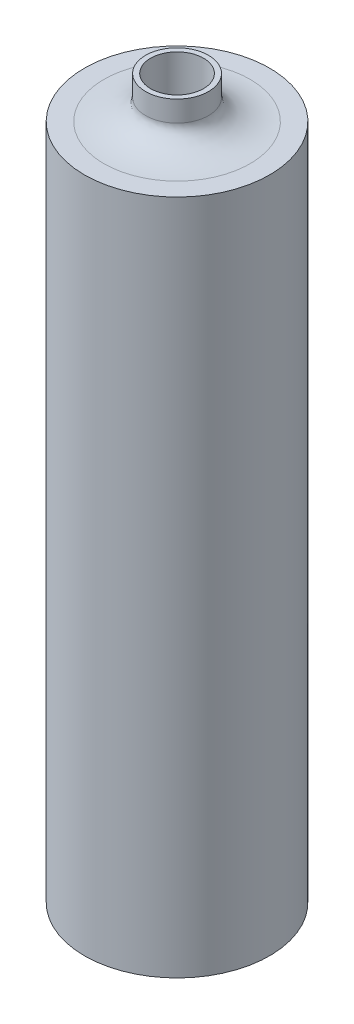
ISO-10303-21;
HEADER;
FILE_DESCRIPTION(('STEP AP214'),'2;1');
FILE_NAME('part.step','',(''),(''),'','','');
FILE_SCHEMA(('AUTOMOTIVE_DESIGN { 1 0 10303 214 1 1 1 1 }'));
ENDSEC;
DATA;
#1=APPLICATION_CONTEXT('core data for automotive mechanical design processes');
#2=APPLICATION_PROTOCOL_DEFINITION('international standard','automotive_design',2000,#1);
#3=PRODUCT_CONTEXT('',#1,'mechanical');
#4=PRODUCT('Part','Part','',(#3));
#5=PRODUCT_RELATED_PRODUCT_CATEGORY('part','',(#4));
#6=PRODUCT_DEFINITION_FORMATION('','',#4);
#7=PRODUCT_DEFINITION_CONTEXT('part definition',#1,'design');
#8=PRODUCT_DEFINITION('design','',#6,#7);
#9=PRODUCT_DEFINITION_SHAPE('','',#8);
#10=(LENGTH_UNIT() NAMED_UNIT(*) SI_UNIT(.MILLI.,.METRE.));
#11=(NAMED_UNIT(*) PLANE_ANGLE_UNIT() SI_UNIT($,.RADIAN.));
#12=(NAMED_UNIT(*) SI_UNIT($,.STERADIAN.) SOLID_ANGLE_UNIT());
#13=UNCERTAINTY_MEASURE_WITH_UNIT(LENGTH_MEASURE(1.E-05),#10,'distance_accuracy_value','');
#14=(GEOMETRIC_REPRESENTATION_CONTEXT(3) GLOBAL_UNCERTAINTY_ASSIGNED_CONTEXT((#13)) GLOBAL_UNIT_ASSIGNED_CONTEXT((#10,
#11,#12)) REPRESENTATION_CONTEXT('',''));
#15=CARTESIAN_POINT('',(0.,0.,0.));
#16=DIRECTION('',(0.,0.,1.));
#17=DIRECTION('',(1.,0.,0.));
#18=AXIS2_PLACEMENT_3D('',#15,#16,#17);
#19=CARTESIAN_POINT('',(0.,162.4,0.));
#20=DIRECTION('',(0.,1.,0.));
#21=DIRECTION('',(0.,0.,1.));
#22=AXIS2_PLACEMENT_3D('',#19,#20,#21);
#23=PLANE('',#22);
#24=CARTESIAN_POINT('',(0.,162.4,17.55));
#25=CARTESIAN_POINT('',(2.29728962670413,162.4,17.55));
#26=CARTESIAN_POINT('',(4.5936753716554,162.4,17.0932204750535));
#27=CARTESIAN_POINT('',(8.83851310435925,162.4,15.3349511160926));
#28=CARTESIAN_POINT('',(10.7852949364395,162.4,14.0341530832083));
#29=CARTESIAN_POINT('',(14.0341530832083,162.4,10.7852949364395));
#30=CARTESIAN_POINT('',(15.3349511160966,162.4,8.83851310436124));
#31=CARTESIAN_POINT('',(17.0932204750496,162.4,4.5936753716534));
#32=CARTESIAN_POINT('',(17.55,162.4,2.29728962669443));
#33=CARTESIAN_POINT('',(17.55,162.4,-2.29728962669442));
#34=CARTESIAN_POINT('',(17.0932204750535,162.4,-4.59367537165341));
#35=CARTESIAN_POINT('',(15.3349511160926,162.4,-8.83851310436125));
#36=CARTESIAN_POINT('',(14.0341530832067,162.4,-10.7852949364372));
#37=CARTESIAN_POINT('',(10.7852949364411,162.4,-14.0341530832107));
#38=CARTESIAN_POINT('',(8.83851310436157,162.4,-15.3349511160892));
#39=CARTESIAN_POINT('',(4.59367537165313,162.4,-17.093220475057));
#40=CARTESIAN_POINT('',(2.29728962669443,162.4,-17.55));
#41=CARTESIAN_POINT('',(-2.29728962669442,162.4,-17.55));
#42=CARTESIAN_POINT('',(-4.59367537165408,162.4,-17.093220475053));
#43=CARTESIAN_POINT('',(-8.83851310436053,162.4,-15.3349511160932));
#44=CARTESIAN_POINT('',(-10.7852949364372,162.4,-14.0341530832087));
#45=CARTESIAN_POINT('',(-14.0341530832107,162.4,-10.7852949364391));
#46=CARTESIAN_POINT('',(-15.3349511160921,162.4,-8.83851310436097));
#47=CARTESIAN_POINT('',(-17.0932204750541,162.4,-4.59367537165373));
#48=CARTESIAN_POINT('',(-17.55,162.4,-2.2972896266944));
#49=CARTESIAN_POINT('',(-17.55,162.4,2.29728962669445));
#50=CARTESIAN_POINT('',(-17.0932204750501,162.4,4.59367537165368));
#51=CARTESIAN_POINT('',(-15.3349511160961,162.4,8.83851310436092));
#52=CARTESIAN_POINT('',(-14.03415308321,162.4,10.7852949364398));
#53=CARTESIAN_POINT('',(-10.7852949364379,162.4,14.0341530832079));
#54=CARTESIAN_POINT('',(-8.83851310436097,162.4,15.3349511160921));
#55=CARTESIAN_POINT('',(-4.59367537165373,162.4,17.0932204750541));
#56=CARTESIAN_POINT('',(-2.29728962670413,162.4,17.55));
#57=CARTESIAN_POINT('',(0.,162.4,17.55));
#58=(BOUNDED_CURVE() B_SPLINE_CURVE(3,(#24,#25,#26,#27,#28,#29,#30,#31,#32,#33,#34,#35,#36,#37,
#38,#39,#40,#41,#42,#43,#44,#45,#46,#47,#48,#49,#50,#51,#52,#53,#54,#55,#56,#57),.UNSPECIFIED.,
.T.,.F.) B_SPLINE_CURVE_WITH_KNOTS((4,2,2,2,2,2,2,2,2,2,2,2,2,2,2,2,4),(0.,0.392699081698724,
0.785398163397448,1.17809724509617,1.5707963267949,1.96349540849362,2.35619449019234,
2.74889357189107,3.14159265358979,3.53429173528852,3.92699081698724,4.31968989868597,
4.71238898038469,5.10508806208341,5.49778714378214,5.89048622548086,6.28318530717959),
.UNSPECIFIED.) CURVE() GEOMETRIC_REPRESENTATION_ITEM() RATIONAL_B_SPLINE_CURVE((1.,1.,1.,1.,1.,
1.,1.,1.,1.,1.,1.,1.,1.,1.,1.,1.,1.,1.,1.,1.,1.,1.,1.,1.,1.,1.,1.,1.,1.,1.,1.,1.,1.,1.)) REPRESENTATION_ITEM(''));
#59=CARTESIAN_POINT('',(0.,162.4,17.55));
#60=VERTEX_POINT('',#59);
#61=EDGE_CURVE('E11',#60,#60,#58,.F.);
#62=ORIENTED_EDGE('',*,*,#61,.T.);
#63=EDGE_LOOP('',(#62));
#64=FACE_BOUND('',#63,.T.);
#65=CARTESIAN_POINT('',(0.,162.4,0.));
#66=DIRECTION('',(0.,1.,0.));
#67=DIRECTION('',(0.,0.,1.));
#68=AXIS2_PLACEMENT_3D('',#65,#66,#67);
#69=CIRCLE('',#68,22.225);
#70=CARTESIAN_POINT('',(0.,162.4,22.225));
#71=VERTEX_POINT('',#70);
#72=EDGE_CURVE('E212',#71,#71,#69,.T.);
#73=ORIENTED_EDGE('',*,*,#72,.T.);
#74=EDGE_LOOP('',(#73));
#75=FACE_BOUND('',#74,.T.);
#76=ADVANCED_FACE('F40',(#64,#75),#23,.T.);
#77=CARTESIAN_POINT('',(0.,0.,0.));
#78=DIRECTION('',(0.,1.,0.));
#79=DIRECTION('',(0.,0.,1.));
#80=AXIS2_PLACEMENT_3D('',#77,#78,#79);
#81=PLANE('',#80);
#82=CARTESIAN_POINT('',(0.,0.,0.));
#83=DIRECTION('',(0.,1.,0.));
#84=DIRECTION('',(0.,0.,1.));
#85=AXIS2_PLACEMENT_3D('',#82,#83,#84);
#86=CIRCLE('',#85,22.225);
#87=CARTESIAN_POINT('',(0.,0.,22.225));
#88=VERTEX_POINT('',#87);
#89=EDGE_CURVE('E58',#88,#88,#86,.T.);
#90=ORIENTED_EDGE('',*,*,#89,.F.);
#91=EDGE_LOOP('',(#90));
#92=FACE_BOUND('',#91,.T.);
#93=CARTESIAN_POINT('',(0.,0.,0.));
#94=DIRECTION('',(0.,1.,0.));
#95=DIRECTION('',(0.,0.,1.));
#96=AXIS2_PLACEMENT_3D('',#93,#94,#95);
#97=CIRCLE('',#96,19.05);
#98=CARTESIAN_POINT('',(0.,0.,19.05));
#99=VERTEX_POINT('',#98);
#100=EDGE_CURVE('E63',#99,#99,#97,.T.);
#101=ORIENTED_EDGE('',*,*,#100,.T.);
#102=EDGE_LOOP('',(#101));
#103=FACE_BOUND('',#102,.T.);
#104=ADVANCED_FACE('F95',(#92,#103),#81,.F.);
#105=CARTESIAN_POINT('',(0.,160.,0.));
#106=DIRECTION('',(0.,-1.,0.));
#107=DIRECTION('',(0.,0.,-1.));
#108=AXIS2_PLACEMENT_3D('',#105,#106,#107);
#109=CYLINDRICAL_SURFACE('',#108,22.225);
#110=ORIENTED_EDGE('',*,*,#89,.T.);
#111=EDGE_LOOP('',(#110));
#112=FACE_BOUND('',#111,.T.);
#113=ORIENTED_EDGE('',*,*,#72,.F.);
#114=EDGE_LOOP('',(#113));
#115=FACE_BOUND('',#114,.T.);
#116=ADVANCED_FACE('F144',(#112,#115),#109,.T.);
#117=CARTESIAN_POINT('',(0.,160.,0.));
#118=DIRECTION('',(0.,-1.,0.));
#119=DIRECTION('',(0.,0.,-1.));
#120=AXIS2_PLACEMENT_3D('',#117,#118,#119);
#121=CYLINDRICAL_SURFACE('',#120,19.05);
#122=CARTESIAN_POINT('',(0.,160.,0.));
#123=DIRECTION('',(0.,1.,0.));
#124=DIRECTION('',(0.,0.,1.));
#125=AXIS2_PLACEMENT_3D('',#122,#123,#124);
#126=CIRCLE('',#125,19.05);
#127=CARTESIAN_POINT('',(0.,160.,19.05));
#128=VERTEX_POINT('',#127);
#129=EDGE_CURVE('E68',#128,#128,#126,.T.);
#130=ORIENTED_EDGE('',*,*,#129,.T.);
#131=EDGE_LOOP('',(#130));
#132=FACE_BOUND('',#131,.T.);
#133=ORIENTED_EDGE('',*,*,#100,.F.);
#134=EDGE_LOOP('',(#133));
#135=FACE_BOUND('',#134,.T.);
#136=ADVANCED_FACE('F139',(#132,#135),#121,.F.);
#137=CARTESIAN_POINT('',(0.,160.,0.));
#138=DIRECTION('',(0.,1.,0.));
#139=DIRECTION('',(0.,0.,1.));
#140=AXIS2_PLACEMENT_3D('',#137,#138,#139);
#141=PLANE('',#140);
#142=CARTESIAN_POINT('',(0.,160.,0.));
#143=DIRECTION('',(0.,1.,0.));
#144=DIRECTION('',(0.,0.,1.));
#145=AXIS2_PLACEMENT_3D('',#142,#143,#144);
#146=CIRCLE('',#145,6.35);
#147=CARTESIAN_POINT('',(0.,160.,6.35));
#148=VERTEX_POINT('',#147);
#149=EDGE_CURVE('E214',#148,#148,#146,.T.);
#150=ORIENTED_EDGE('',*,*,#149,.T.);
#151=EDGE_LOOP('',(#150));
#152=FACE_BOUND('',#151,.T.);
#153=ORIENTED_EDGE('',*,*,#129,.F.);
#154=EDGE_LOOP('',(#153));
#155=FACE_BOUND('',#154,.T.);
#156=ADVANCED_FACE('F90',(#152,#155),#141,.F.);
#157=CARTESIAN_POINT('',(0.,162.4,0.));
#158=DIRECTION('',(0.,-1.,0.));
#159=DIRECTION('',(0.,0.,-1.));
#160=AXIS2_PLACEMENT_3D('',#157,#158,#159);
#161=CYLINDRICAL_SURFACE('',#160,6.35);
#162=ORIENTED_EDGE('',*,*,#149,.F.);
#163=EDGE_LOOP('',(#162));
#164=FACE_BOUND('',#163,.T.);
#165=CARTESIAN_POINT('',(0.,172.4,0.));
#166=DIRECTION('',(0.,1.,0.));
#167=DIRECTION('',(0.,0.,1.));
#168=AXIS2_PLACEMENT_3D('',#165,#166,#167);
#169=CIRCLE('',#168,6.35);
#170=CARTESIAN_POINT('',(0.,172.4,6.35));
#171=VERTEX_POINT('',#170);
#172=EDGE_CURVE('E222',#171,#171,#169,.T.);
#173=ORIENTED_EDGE('',*,*,#172,.T.);
#174=EDGE_LOOP('',(#173));
#175=FACE_BOUND('',#174,.T.);
#176=ADVANCED_FACE('F87',(#164,#175),#161,.F.);
#177=CARTESIAN_POINT('',(0.,172.4,0.));
#178=DIRECTION('',(0.,1.,0.));
#179=DIRECTION('',(0.,0.,1.));
#180=AXIS2_PLACEMENT_3D('',#177,#178,#179);
#181=PLANE('',#180);
#182=CARTESIAN_POINT('',(0.,172.4,0.));
#183=DIRECTION('',(0.,1.,0.));
#184=DIRECTION('',(0.,0.,1.));
#185=AXIS2_PLACEMENT_3D('',#182,#183,#184);
#186=CIRCLE('',#185,7.55);
#187=CARTESIAN_POINT('',(0.,172.4,7.55));
#188=VERTEX_POINT('',#187);
#189=EDGE_CURVE('E219',#188,#188,#186,.T.);
#190=ORIENTED_EDGE('',*,*,#189,.T.);
#191=EDGE_LOOP('',(#190));
#192=FACE_BOUND('',#191,.T.);
#193=ORIENTED_EDGE('',*,*,#172,.F.);
#194=EDGE_LOOP('',(#193));
#195=FACE_BOUND('',#194,.T.);
#196=ADVANCED_FACE('F86',(#192,#195),#181,.T.);
#197=CARTESIAN_POINT('',(0.,172.4,0.));
#198=DIRECTION('',(0.,-1.,0.));
#199=DIRECTION('',(0.,0.,-1.));
#200=AXIS2_PLACEMENT_3D('',#197,#198,#199);
#201=CYLINDRICAL_SURFACE('',#200,7.55);
#202=CARTESIAN_POINT('',(0.,167.4,7.55));
#203=CARTESIAN_POINT('',(-0.98829268841118,167.4,7.55));
#204=CARTESIAN_POINT('',(-1.97619652740688,167.4,7.35349370864103));
#205=CARTESIAN_POINT('',(-3.80232330130599,167.4,6.59708723227939));
#206=CARTESIAN_POINT('',(-4.63982773618855,167.4,6.03748465972832));
#207=CARTESIAN_POINT('',(-6.03748465972835,167.4,4.63982773618851));
#208=CARTESIAN_POINT('',(-6.59708723227952,167.4,3.80232330130569));
#209=CARTESIAN_POINT('',(-7.35349370864092,167.4,1.97619652740714));
#210=CARTESIAN_POINT('',(-7.55,167.4,0.988292688407016));
#211=CARTESIAN_POINT('',(-7.55,167.4,-0.988292688406992));
#212=CARTESIAN_POINT('',(-7.35349370864144,167.4,-1.9761965274059));
#213=CARTESIAN_POINT('',(-6.59708723227898,167.4,-3.80232330130698));
#214=CARTESIAN_POINT('',(-6.0374846597293,167.4,-4.63982773618756));
#215=CARTESIAN_POINT('',(-4.63982773618757,167.4,-6.0374846597293));
#216=CARTESIAN_POINT('',(-3.80232330130615,167.4,-6.59708723227933));
#217=CARTESIAN_POINT('',(-1.97619652740668,167.4,-7.35349370864111));
#218=CARTESIAN_POINT('',(-0.988292688407002,167.4,-7.55));
#219=CARTESIAN_POINT('',(0.988292688407004,167.4,-7.55));
#220=CARTESIAN_POINT('',(1.97619652740657,167.4,-7.35349370864116));
#221=CARTESIAN_POINT('',(3.80232330130631,167.4,-6.59708723227926));
#222=CARTESIAN_POINT('',(4.63982773618906,167.4,-6.03748465972781));
#223=CARTESIAN_POINT('',(6.0374846597278,167.4,-4.63982773618907));
#224=CARTESIAN_POINT('',(6.59708723227974,167.4,-3.80232330130516));
#225=CARTESIAN_POINT('',(7.35349370864069,167.4,-1.9761965274077));
#226=CARTESIAN_POINT('',(7.55,167.4,-0.988292688407003));
#227=CARTESIAN_POINT('',(7.55,167.4,0.988292688407003));
#228=CARTESIAN_POINT('',(7.35349370864111,167.4,1.9761965274067));
#229=CARTESIAN_POINT('',(6.59708723227933,167.4,3.80232330130615));
#230=CARTESIAN_POINT('',(6.03748465972807,167.4,4.63982773618879));
#231=CARTESIAN_POINT('',(4.63982773618879,167.4,6.03748465972807));
#232=CARTESIAN_POINT('',(3.80232330130629,167.4,6.59708723227927));
#233=CARTESIAN_POINT('',(1.97619652740657,167.4,7.35349370864116));
#234=CARTESIAN_POINT('',(0.988292688411179,167.4,7.55));
#235=CARTESIAN_POINT('',(0.,167.4,7.55));
#236=(BOUNDED_CURVE() B_SPLINE_CURVE(3,(#202,#203,#204,#205,#206,#207,#208,#209,#210,#211,#212,
#213,#214,#215,#216,#217,#218,#219,#220,#221,#222,#223,#224,#225,#226,#227,#228,#229,#230,#231,
#232,#233,#234,#235),.UNSPECIFIED.,.T.,.F.) B_SPLINE_CURVE_WITH_KNOTS((4,2,2,2,2,2,2,2,2,2,2,2,
2,2,2,2,4),(0.,0.392699081698725,0.785398163397448,1.17809724509617,1.5707963267949,
1.96349540849362,2.35619449019234,2.74889357189107,3.14159265358979,3.53429173528852,
3.92699081698724,4.31968989868597,4.71238898038469,5.10508806208341,5.49778714378214,
5.89048622548086,6.28318530717959),
.UNSPECIFIED.) CURVE() GEOMETRIC_REPRESENTATION_ITEM() RATIONAL_B_SPLINE_CURVE((1.,1.,1.,1.,1.,
1.,1.,1.,1.,1.,1.,1.,1.,1.,1.,1.,1.,1.,1.,1.,1.,1.,1.,1.,1.,1.,1.,1.,1.,1.,1.,1.,1.,1.)) REPRESENTATION_ITEM(''));
#237=CARTESIAN_POINT('',(0.,167.4,7.55));
#238=VERTEX_POINT('',#237);
#239=EDGE_CURVE('E53',#238,#238,#236,.F.);
#240=ORIENTED_EDGE('',*,*,#239,.T.);
#241=EDGE_LOOP('',(#240));
#242=FACE_BOUND('',#241,.T.);
#243=ORIENTED_EDGE('',*,*,#189,.F.);
#244=EDGE_LOOP('',(#243));
#245=FACE_BOUND('',#244,.T.);
#246=ADVANCED_FACE('F76',(#242,#245),#201,.T.);
#247=CARTESIAN_POINT('',(0.,167.4,7.55));
#248=CARTESIAN_POINT('',(0.988292688411179,167.4,7.55));
#249=CARTESIAN_POINT('',(1.97619652740657,167.4,7.35349370864116));
#250=CARTESIAN_POINT('',(3.80232330130629,167.4,6.59708723227927));
#251=CARTESIAN_POINT('',(4.63982773618879,167.4,6.03748465972807));
#252=CARTESIAN_POINT('',(6.03748465972807,167.4,4.63982773618879));
#253=CARTESIAN_POINT('',(6.59708723227933,167.4,3.80232330130615));
#254=CARTESIAN_POINT('',(7.35349370864111,167.4,1.9761965274067));
#255=CARTESIAN_POINT('',(7.55,167.4,0.988292688407003));
#256=CARTESIAN_POINT('',(7.55,167.4,-0.988292688407003));
#257=CARTESIAN_POINT('',(7.35349370864069,167.4,-1.9761965274077));
#258=CARTESIAN_POINT('',(6.59708723227974,167.4,-3.80232330130516));
#259=CARTESIAN_POINT('',(6.0374846597278,167.4,-4.63982773618907));
#260=CARTESIAN_POINT('',(4.63982773618906,167.4,-6.03748465972781));
#261=CARTESIAN_POINT('',(3.80232330130631,167.4,-6.59708723227926));
#262=CARTESIAN_POINT('',(1.97619652740657,167.4,-7.35349370864116));
#263=CARTESIAN_POINT('',(0.988292688407004,167.4,-7.55));
#264=CARTESIAN_POINT('',(-0.988292688407002,167.4,-7.55));
#265=CARTESIAN_POINT('',(-1.97619652740668,167.4,-7.35349370864111));
#266=CARTESIAN_POINT('',(-3.80232330130615,167.4,-6.59708723227933));
#267=CARTESIAN_POINT('',(-4.63982773618757,167.4,-6.0374846597293));
#268=CARTESIAN_POINT('',(-6.0374846597293,167.4,-4.63982773618756));
#269=CARTESIAN_POINT('',(-6.59708723227898,167.4,-3.80232330130698));
#270=CARTESIAN_POINT('',(-7.35349370864144,167.4,-1.9761965274059));
#271=CARTESIAN_POINT('',(-7.55,167.4,-0.988292688406992));
#272=CARTESIAN_POINT('',(-7.55,167.4,0.988292688407016));
#273=CARTESIAN_POINT('',(-7.35349370864092,167.4,1.97619652740714));
#274=CARTESIAN_POINT('',(-6.59708723227952,167.4,3.80232330130569));
#275=CARTESIAN_POINT('',(-6.03748465972835,167.4,4.63982773618851));
#276=CARTESIAN_POINT('',(-4.63982773618855,167.4,6.03748465972832));
#277=CARTESIAN_POINT('',(-3.80232330130599,167.4,6.59708723227939));
#278=CARTESIAN_POINT('',(-1.97619652740688,167.4,7.35349370864103));
#279=CARTESIAN_POINT('',(-0.98829268841118,167.4,7.55));
#280=CARTESIAN_POINT('',(0.,167.4,7.55));
#281=CARTESIAN_POINT('',(0.,162.4,7.55));
#282=CARTESIAN_POINT('',(0.988292688411179,162.4,7.55));
#283=CARTESIAN_POINT('',(1.97619652740614,162.4,7.35349370864331));
#284=CARTESIAN_POINT('',(3.80232330130672,162.4,6.59708723227711));
#285=CARTESIAN_POINT('',(4.63982773618879,162.4,6.03748465972807));
#286=CARTESIAN_POINT('',(6.03748465972807,162.4,4.63982773618879));
#287=CARTESIAN_POINT('',(6.5970872322831,162.4,3.80232330130821));
#288=CARTESIAN_POINT('',(7.35349370863734,162.4,1.97619652740464));
#289=CARTESIAN_POINT('',(7.54999999999601,162.4,0.988292688407003));
#290=CARTESIAN_POINT('',(7.55000000000399,162.4,-0.988292688407002));
#291=CARTESIAN_POINT('',(7.35349370863933,162.4,-1.97619652740664));
#292=CARTESIAN_POINT('',(6.5970872322811,162.4,-3.80232330130622));
#293=CARTESIAN_POINT('',(6.03748465972681,162.4,-4.63982773618707));
#294=CARTESIAN_POINT('',(4.63982773619005,162.4,-6.0374846597298));
#295=CARTESIAN_POINT('',(3.80232330130381,162.4,-6.59708723227364));
#296=CARTESIAN_POINT('',(1.97619652740907,162.4,-7.35349370864678));
#297=CARTESIAN_POINT('',(0.988292688407004,162.4,-7.55));
#298=CARTESIAN_POINT('',(-0.988292688407002,162.4,-7.55));
#299=CARTESIAN_POINT('',(-1.97619652740456,162.4,-7.35349370864081));
#300=CARTESIAN_POINT('',(-3.80232330130827,162.4,-6.59708723227963));
#301=CARTESIAN_POINT('',(-4.63982773618707,162.4,-6.0374846597298));
#302=CARTESIAN_POINT('',(-6.0374846597298,162.4,-4.63982773618707));
#303=CARTESIAN_POINT('',(-6.59708723227261,162.4,-3.80232330130616));
#304=CARTESIAN_POINT('',(-7.35349370864781,162.4,-1.97619652740672));
#305=CARTESIAN_POINT('',(-7.55000000000199,162.4,-0.988292688406992));
#306=CARTESIAN_POINT('',(-7.54999999999801,162.4,0.988292688407016));
#307=CARTESIAN_POINT('',(-7.35349370863985,162.4,1.9761965274052));
#308=CARTESIAN_POINT('',(-6.59708723228059,162.4,3.80232330130763));
#309=CARTESIAN_POINT('',(-6.03748465972636,162.4,4.63982773618852));
#310=CARTESIAN_POINT('',(-4.63982773619054,162.4,6.03748465972832));
#311=CARTESIAN_POINT('',(-3.80232330130616,162.4,6.59708723227858));
#312=CARTESIAN_POINT('',(-1.97619652740672,162.4,7.35349370864184));
#313=CARTESIAN_POINT('',(-0.98829268841118,162.4,7.55));
#314=CARTESIAN_POINT('',(0.,162.4,7.55));
#315=CARTESIAN_POINT('',(0.,162.4,17.55));
#316=CARTESIAN_POINT('',(2.29728962670413,162.4,17.55));
#317=CARTESIAN_POINT('',(4.5936753716554,162.4,17.0932204750535));
#318=CARTESIAN_POINT('',(8.83851310435925,162.4,15.3349511160926));
#319=CARTESIAN_POINT('',(10.7852949364395,162.4,14.0341530832083));
#320=CARTESIAN_POINT('',(14.0341530832083,162.4,10.7852949364395));
#321=CARTESIAN_POINT('',(15.3349511160966,162.4,8.83851310436124));
#322=CARTESIAN_POINT('',(17.0932204750496,162.4,4.5936753716534));
#323=CARTESIAN_POINT('',(17.55,162.4,2.29728962669443));
#324=CARTESIAN_POINT('',(17.55,162.4,-2.29728962669442));
#325=CARTESIAN_POINT('',(17.0932204750535,162.4,-4.59367537165341));
#326=CARTESIAN_POINT('',(15.3349511160926,162.4,-8.83851310436125));
#327=CARTESIAN_POINT('',(14.0341530832067,162.4,-10.7852949364372));
#328=CARTESIAN_POINT('',(10.7852949364411,162.4,-14.0341530832107));
#329=CARTESIAN_POINT('',(8.83851310436157,162.4,-15.3349511160892));
#330=CARTESIAN_POINT('',(4.59367537165313,162.4,-17.093220475057));
#331=CARTESIAN_POINT('',(2.29728962669443,162.4,-17.55));
#332=CARTESIAN_POINT('',(-2.29728962669442,162.4,-17.55));
#333=CARTESIAN_POINT('',(-4.59367537165408,162.4,-17.093220475053));
#334=CARTESIAN_POINT('',(-8.83851310436053,162.4,-15.3349511160932));
#335=CARTESIAN_POINT('',(-10.7852949364372,162.4,-14.0341530832087));
#336=CARTESIAN_POINT('',(-14.0341530832107,162.4,-10.7852949364391));
#337=CARTESIAN_POINT('',(-15.3349511160921,162.4,-8.83851310436097));
#338=CARTESIAN_POINT('',(-17.0932204750541,162.4,-4.59367537165373));
#339=CARTESIAN_POINT('',(-17.55,162.4,-2.2972896266944));
#340=CARTESIAN_POINT('',(-17.55,162.4,2.29728962669445));
#341=CARTESIAN_POINT('',(-17.0932204750501,162.4,4.59367537165368));
#342=CARTESIAN_POINT('',(-15.3349511160961,162.4,8.83851310436092));
#343=CARTESIAN_POINT('',(-14.03415308321,162.4,10.7852949364398));
#344=CARTESIAN_POINT('',(-10.7852949364379,162.4,14.0341530832079));
#345=CARTESIAN_POINT('',(-8.83851310436097,162.4,15.3349511160921));
#346=CARTESIAN_POINT('',(-4.59367537165373,162.4,17.0932204750541));
#347=CARTESIAN_POINT('',(-2.29728962670413,162.4,17.55));
#348=CARTESIAN_POINT('',(0.,162.4,17.55));
#349=(BOUNDED_SURFACE() B_SPLINE_SURFACE(2,3,((#247,#248,#249,#250,#251,#252,#253,#254,#255,
#256,#257,#258,#259,#260,#261,#262,#263,#264,#265,#266,#267,#268,#269,#270,#271,#272,#273,#274,
#275,#276,#277,#278,#279,#280),(#281,#282,#283,#284,#285,#286,#287,#288,#289,#290,#291,#292,
#293,#294,#295,#296,#297,#298,#299,#300,#301,#302,#303,#304,#305,#306,#307,#308,#309,#310,#311,
#312,#313,#314),(#315,#316,#317,#318,#319,#320,#321,#322,#323,#324,#325,#326,#327,#328,#329,
#330,#331,#332,#333,#334,#335,#336,#337,#338,#339,#340,#341,#342,#343,#344,#345,#346,#347,
#348)),.UNSPECIFIED.,.F.,.T.,.F.) B_SPLINE_SURFACE_WITH_KNOTS((3,3),(4,2,2,2,2,2,2,2,2,2,2,2,2,
2,2,2,4),(0.,1.),(0.,0.392699081698724,0.785398163397448,1.17809724509617,1.5707963267949,
1.96349540849362,2.35619449019234,2.74889357189107,3.14159265358979,3.53429173528852,
3.92699081698724,4.31968989868597,4.71238898038469,5.10508806208341,5.49778714378214,
5.89048622548086,6.28318530717959),
.UNSPECIFIED.) GEOMETRIC_REPRESENTATION_ITEM() RATIONAL_B_SPLINE_SURFACE(((1.,1.,1.,1.,1.,1.,1.,
1.,1.,1.,1.,1.,1.,1.,1.,1.,1.,1.,1.,1.,1.,1.,1.,1.,1.,1.,1.,1.,1.,1.,1.,1.,1.,1.),
(0.707106781186548,0.707106781186548,0.707106781186548,0.707106781186548,0.707106781186548,
0.707106781186548,0.707106781186548,0.707106781186548,0.707106781186548,0.707106781186548,
0.707106781186548,0.707106781186548,0.707106781186548,0.707106781186548,0.707106781186548,
0.707106781186548,0.707106781186548,0.707106781186548,0.707106781186548,0.707106781186548,
0.707106781186547,0.707106781186547,0.707106781186548,0.707106781186548,0.707106781186548,
0.707106781186548,0.707106781186548,0.707106781186548,0.707106781186548,0.707106781186548,
0.707106781186548,0.707106781186548,0.707106781186548,0.707106781186548),(1.,1.,1.,1.,1.,1.,1.,
1.,1.,1.,1.,1.,1.,1.,1.,1.,1.,1.,1.,1.,1.,1.,1.,1.,1.,1.,1.,1.,1.,1.,1.,1.,1.,1.))) REPRESENTATION_ITEM('') SURFACE());
#350=ORIENTED_EDGE('',*,*,#61,.F.);
#351=EDGE_LOOP('',(#350));
#352=FACE_BOUND('',#351,.T.);
#353=ORIENTED_EDGE('',*,*,#239,.F.);
#354=EDGE_LOOP('',(#353));
#355=FACE_BOUND('',#354,.T.);
#356=ADVANCED_FACE('F43',(#352,#355),#349,.T.);
#357=CLOSED_SHELL('',(#76,#104,#116,#136,#156,#176,#196,#246,#356));
#358=MANIFOLD_SOLID_BREP('B2',#357);
#359=ADVANCED_BREP_SHAPE_REPRESENTATION('',(#18,#358),#14);
#360=SHAPE_DEFINITION_REPRESENTATION(#9,#359);
ENDSEC;
END-ISO-10303-21;
